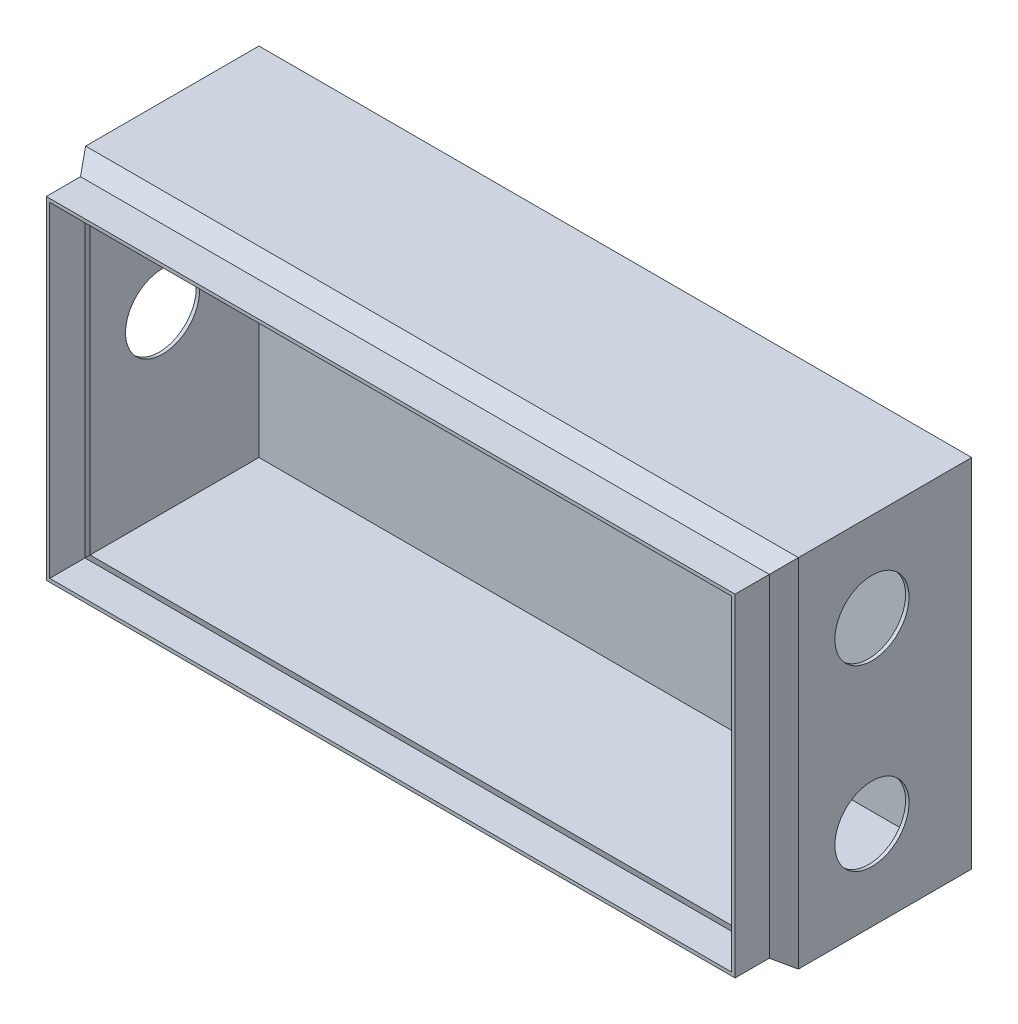
ISO-10303-21;
HEADER;
FILE_DESCRIPTION(('STEP AP214'),'2;1');
FILE_NAME('part.step','',(''),(''),'','','');
FILE_SCHEMA(('AUTOMOTIVE_DESIGN { 1 0 10303 214 1 1 1 1 }'));
ENDSEC;
DATA;
#1=APPLICATION_CONTEXT('core data for automotive mechanical design processes');
#2=APPLICATION_PROTOCOL_DEFINITION('international standard','automotive_design',2000,#1);
#3=PRODUCT_CONTEXT('',#1,'mechanical');
#4=PRODUCT('Part','Part','',(#3));
#5=PRODUCT_RELATED_PRODUCT_CATEGORY('part','',(#4));
#6=PRODUCT_DEFINITION_FORMATION('','',#4);
#7=PRODUCT_DEFINITION_CONTEXT('part definition',#1,'design');
#8=PRODUCT_DEFINITION('design','',#6,#7);
#9=PRODUCT_DEFINITION_SHAPE('','',#8);
#10=(LENGTH_UNIT() NAMED_UNIT(*) SI_UNIT(.MILLI.,.METRE.));
#11=(NAMED_UNIT(*) PLANE_ANGLE_UNIT() SI_UNIT($,.RADIAN.));
#12=(NAMED_UNIT(*) SI_UNIT($,.STERADIAN.) SOLID_ANGLE_UNIT());
#13=UNCERTAINTY_MEASURE_WITH_UNIT(LENGTH_MEASURE(1.E-05),#10,'distance_accuracy_value','');
#14=(GEOMETRIC_REPRESENTATION_CONTEXT(3) GLOBAL_UNCERTAINTY_ASSIGNED_CONTEXT((#13)) GLOBAL_UNIT_ASSIGNED_CONTEXT((#10,
#11,#12)) REPRESENTATION_CONTEXT('',''));
#15=CARTESIAN_POINT('',(0.,0.,0.));
#16=DIRECTION('',(0.,0.,1.));
#17=DIRECTION('',(1.,0.,0.));
#18=AXIS2_PLACEMENT_3D('',#15,#16,#17);
#19=CARTESIAN_POINT('',(-125.,-62.5,60.8));
#20=DIRECTION('',(0.,1.,0.));
#21=DIRECTION('',(-1.,0.,0.));
#22=AXIS2_PLACEMENT_3D('',#19,#20,#21);
#23=PLANE('',#22);
#24=DIRECTION('',(1.,0.,0.));
#25=VECTOR('',#24,1.);
#26=CARTESIAN_POINT('',(-125.,-62.5,0.));
#27=LINE('',#26,#25);
#28=CARTESIAN_POINT('',(-125.,-62.5,0.));
#29=VERTEX_POINT('',#28);
#30=CARTESIAN_POINT('',(125.,-62.5,0.));
#31=VERTEX_POINT('',#30);
#32=EDGE_CURVE('E260',#29,#31,#27,.T.);
#33=ORIENTED_EDGE('',*,*,#32,.T.);
#34=DIRECTION('',(0.,0.,-1.));
#35=VECTOR('',#34,1.);
#36=CARTESIAN_POINT('',(125.,-62.5,60.8));
#37=LINE('',#36,#35);
#38=CARTESIAN_POINT('',(125.,-62.5,60.8));
#39=VERTEX_POINT('',#38);
#40=EDGE_CURVE('E11',#39,#31,#37,.T.);
#41=ORIENTED_EDGE('',*,*,#40,.F.);
#42=DIRECTION('',(1.,0.,0.));
#43=VECTOR('',#42,1.);
#44=CARTESIAN_POINT('',(-125.,-62.5,60.8));
#45=LINE('',#44,#43);
#46=CARTESIAN_POINT('',(-125.,-62.5,60.8));
#47=VERTEX_POINT('',#46);
#48=EDGE_CURVE('E281',#47,#39,#45,.T.);
#49=ORIENTED_EDGE('',*,*,#48,.F.);
#50=DIRECTION('',(0.,0.,-1.));
#51=VECTOR('',#50,1.);
#52=CARTESIAN_POINT('',(-125.,-62.5,60.8));
#53=LINE('',#52,#51);
#54=EDGE_CURVE('E291',#47,#29,#53,.T.);
#55=ORIENTED_EDGE('',*,*,#54,.T.);
#56=EDGE_LOOP('',(#33,#41,#49,#55));
#57=FACE_BOUND('',#56,.T.);
#58=ADVANCED_FACE('F36',(#57),#23,.F.);
#59=CARTESIAN_POINT('',(125.,-62.5,60.8));
#60=DIRECTION('',(-1.,0.,0.));
#61=DIRECTION('',(0.,0.,1.));
#62=AXIS2_PLACEMENT_3D('',#59,#60,#61);
#63=PLANE('',#62);
#64=CARTESIAN_POINT('',(125.,-31.25,35.));
#65=DIRECTION('',(1.,0.,0.));
#66=DIRECTION('',(0.,0.,-1.));
#67=AXIS2_PLACEMENT_3D('',#64,#65,#66);
#68=CIRCLE('',#67,13.);
#69=CARTESIAN_POINT('',(125.,-31.25,22.));
#70=VERTEX_POINT('',#69);
#71=EDGE_CURVE('E317',#70,#70,#68,.T.);
#72=ORIENTED_EDGE('',*,*,#71,.F.);
#73=EDGE_LOOP('',(#72));
#74=FACE_BOUND('',#73,.T.);
#75=CARTESIAN_POINT('',(125.,31.25,35.));
#76=DIRECTION('',(1.,0.,0.));
#77=DIRECTION('',(0.,0.,-1.));
#78=AXIS2_PLACEMENT_3D('',#75,#76,#77);
#79=CIRCLE('',#78,13.);
#80=CARTESIAN_POINT('',(125.,31.25,22.));
#81=VERTEX_POINT('',#80);
#82=EDGE_CURVE('E307',#81,#81,#79,.T.);
#83=ORIENTED_EDGE('',*,*,#82,.F.);
#84=EDGE_LOOP('',(#83));
#85=FACE_BOUND('',#84,.T.);
#86=DIRECTION('',(0.,1.,0.));
#87=VECTOR('',#86,1.);
#88=CARTESIAN_POINT('',(125.,-62.5,0.));
#89=LINE('',#88,#87);
#90=CARTESIAN_POINT('',(125.,62.5,0.));
#91=VERTEX_POINT('',#90);
#92=EDGE_CURVE('E294',#31,#91,#89,.T.);
#93=ORIENTED_EDGE('',*,*,#92,.T.);
#94=DIRECTION('',(0.,0.,-1.));
#95=VECTOR('',#94,1.);
#96=CARTESIAN_POINT('',(125.,62.5,60.8));
#97=LINE('',#96,#95);
#98=CARTESIAN_POINT('',(125.,62.5,60.8));
#99=VERTEX_POINT('',#98);
#100=EDGE_CURVE('E44',#99,#91,#97,.T.);
#101=ORIENTED_EDGE('',*,*,#100,.F.);
#102=DIRECTION('',(0.,1.,0.));
#103=VECTOR('',#102,1.);
#104=CARTESIAN_POINT('',(125.,-62.5,60.8));
#105=LINE('',#104,#103);
#106=EDGE_CURVE('E86',#39,#99,#105,.T.);
#107=ORIENTED_EDGE('',*,*,#106,.F.);
#108=ORIENTED_EDGE('',*,*,#40,.T.);
#109=EDGE_LOOP('',(#93,#101,#107,#108));
#110=FACE_BOUND('',#109,.T.);
#111=ADVANCED_FACE('F376',(#74,#85,#110),#63,.F.);
#112=CARTESIAN_POINT('',(-125.,62.5,60.8));
#113=DIRECTION('',(0.,-1.,0.));
#114=DIRECTION('',(0.,0.,-1.));
#115=AXIS2_PLACEMENT_3D('',#112,#113,#114);
#116=PLANE('',#115);
#117=DIRECTION('',(-1.,0.,0.));
#118=VECTOR('',#117,1.);
#119=CARTESIAN_POINT('',(-125.,62.5,0.));
#120=LINE('',#119,#118);
#121=CARTESIAN_POINT('',(-125.,62.5,0.));
#122=VERTEX_POINT('',#121);
#123=EDGE_CURVE('E296',#91,#122,#120,.T.);
#124=ORIENTED_EDGE('',*,*,#123,.T.);
#125=DIRECTION('',(0.,0.,-1.));
#126=VECTOR('',#125,1.);
#127=CARTESIAN_POINT('',(-125.,62.5,60.8));
#128=LINE('',#127,#126);
#129=CARTESIAN_POINT('',(-125.,62.5,60.8));
#130=VERTEX_POINT('',#129);
#131=EDGE_CURVE('E61',#130,#122,#128,.T.);
#132=ORIENTED_EDGE('',*,*,#131,.F.);
#133=DIRECTION('',(-1.,0.,0.));
#134=VECTOR('',#133,1.);
#135=CARTESIAN_POINT('',(-125.,62.5,60.8));
#136=LINE('',#135,#134);
#137=EDGE_CURVE('E285',#99,#130,#136,.T.);
#138=ORIENTED_EDGE('',*,*,#137,.F.);
#139=ORIENTED_EDGE('',*,*,#100,.T.);
#140=EDGE_LOOP('',(#124,#132,#138,#139));
#141=FACE_BOUND('',#140,.T.);
#142=ADVANCED_FACE('F381',(#141),#116,.F.);
#143=CARTESIAN_POINT('',(-125.,-62.5,60.8));
#144=DIRECTION('',(1.,0.,0.));
#145=DIRECTION('',(0.,0.,-1.));
#146=AXIS2_PLACEMENT_3D('',#143,#144,#145);
#147=PLANE('',#146);
#148=CARTESIAN_POINT('',(-125.,0.,35.));
#149=DIRECTION('',(-1.,0.,0.));
#150=DIRECTION('',(0.,0.,1.));
#151=AXIS2_PLACEMENT_3D('',#148,#149,#150);
#152=CIRCLE('',#151,13.);
#153=CARTESIAN_POINT('',(-125.,0.,48.));
#154=VERTEX_POINT('',#153);
#155=EDGE_CURVE('E304',#154,#154,#152,.T.);
#156=ORIENTED_EDGE('',*,*,#155,.F.);
#157=EDGE_LOOP('',(#156));
#158=FACE_BOUND('',#157,.T.);
#159=DIRECTION('',(0.,-1.,0.));
#160=VECTOR('',#159,1.);
#161=CARTESIAN_POINT('',(-125.,-62.5,0.));
#162=LINE('',#161,#160);
#163=EDGE_CURVE('E81',#122,#29,#162,.T.);
#164=ORIENTED_EDGE('',*,*,#163,.T.);
#165=ORIENTED_EDGE('',*,*,#54,.F.);
#166=DIRECTION('',(0.,-1.,0.));
#167=VECTOR('',#166,1.);
#168=CARTESIAN_POINT('',(-125.,-62.5,60.8));
#169=LINE('',#168,#167);
#170=EDGE_CURVE('E288',#130,#47,#169,.T.);
#171=ORIENTED_EDGE('',*,*,#170,.F.);
#172=ORIENTED_EDGE('',*,*,#131,.T.);
#173=EDGE_LOOP('',(#164,#165,#171,#172));
#174=FACE_BOUND('',#173,.T.);
#175=ADVANCED_FACE('F438',(#158,#174),#147,.F.);
#176=CARTESIAN_POINT('',(0.,0.,0.));
#177=DIRECTION('',(0.,0.,1.));
#178=DIRECTION('',(1.,0.,0.));
#179=AXIS2_PLACEMENT_3D('',#176,#177,#178);
#180=PLANE('',#179);
#181=ORIENTED_EDGE('',*,*,#32,.F.);
#182=ORIENTED_EDGE('',*,*,#163,.F.);
#183=ORIENTED_EDGE('',*,*,#123,.F.);
#184=ORIENTED_EDGE('',*,*,#92,.F.);
#185=EDGE_LOOP('',(#181,#182,#183,#184));
#186=FACE_BOUND('',#185,.T.);
#187=ADVANCED_FACE('F385',(#186),#180,.F.);
#188=CARTESIAN_POINT('',(-125.,-62.5,60.8));
#189=DIRECTION('',(0.,-0.819152044288991,0.573576436351047));
#190=DIRECTION('',(0.,-0.573576436351047,-0.819152044288991));
#191=AXIS2_PLACEMENT_3D('',#188,#189,#190);
#192=PLANE('',#191);
#193=ORIENTED_EDGE('',*,*,#48,.T.);
#194=DIRECTION('',(0.497542812164524,-0.497542812164524,-0.710564775461629));
#195=VECTOR('',#194,1.);
#196=CARTESIAN_POINT('',(125.,-62.5,60.8));
#197=LINE('',#196,#195);
#198=CARTESIAN_POINT('',(120.798754770742,-58.2987547707417,66.8));
#199=VERTEX_POINT('',#198);
#200=EDGE_CURVE('E257',#199,#39,#197,.T.);
#201=ORIENTED_EDGE('',*,*,#200,.F.);
#202=DIRECTION('',(-1.,0.,0.));
#203=VECTOR('',#202,1.);
#204=CARTESIAN_POINT('',(-125.,-58.2987547707417,66.8));
#205=LINE('',#204,#203);
#206=CARTESIAN_POINT('',(-120.798754770742,-58.2987547707417,66.8));
#207=VERTEX_POINT('',#206);
#208=EDGE_CURVE('E256',#207,#199,#205,.F.);
#209=ORIENTED_EDGE('',*,*,#208,.F.);
#210=DIRECTION('',(-0.497542812164524,-0.497542812164524,-0.710564775461629));
#211=VECTOR('',#210,1.);
#212=CARTESIAN_POINT('',(-125.,-62.5,60.8));
#213=LINE('',#212,#211);
#214=EDGE_CURVE('E262',#207,#47,#213,.T.);
#215=ORIENTED_EDGE('',*,*,#214,.T.);
#216=EDGE_LOOP('',(#193,#201,#209,#215));
#217=FACE_BOUND('',#216,.T.);
#218=ADVANCED_FACE('F409',(#217),#192,.T.);
#219=CARTESIAN_POINT('',(125.,-62.5,60.8));
#220=DIRECTION('',(0.819152044288991,0.,0.573576436351047));
#221=DIRECTION('',(0.573576436351047,0.,-0.819152044288991));
#222=AXIS2_PLACEMENT_3D('',#219,#220,#221);
#223=PLANE('',#222);
#224=ORIENTED_EDGE('',*,*,#106,.T.);
#225=DIRECTION('',(0.497542812164524,0.497542812164524,-0.710564775461629));
#226=VECTOR('',#225,1.);
#227=CARTESIAN_POINT('',(125.,62.5,60.8));
#228=LINE('',#227,#226);
#229=CARTESIAN_POINT('',(120.798754770742,58.2987547707417,66.8));
#230=VERTEX_POINT('',#229);
#231=EDGE_CURVE('E261',#230,#99,#228,.T.);
#232=ORIENTED_EDGE('',*,*,#231,.F.);
#233=DIRECTION('',(0.,-1.,0.));
#234=VECTOR('',#233,1.);
#235=CARTESIAN_POINT('',(120.798754770742,-62.5,66.8));
#236=LINE('',#235,#234);
#237=EDGE_CURVE('E273',#199,#230,#236,.F.);
#238=ORIENTED_EDGE('',*,*,#237,.F.);
#239=ORIENTED_EDGE('',*,*,#200,.T.);
#240=EDGE_LOOP('',(#224,#232,#238,#239));
#241=FACE_BOUND('',#240,.T.);
#242=ADVANCED_FACE('F389',(#241),#223,.T.);
#243=CARTESIAN_POINT('',(125.,62.5,60.8));
#244=DIRECTION('',(0.,0.819152044288991,0.573576436351047));
#245=DIRECTION('',(0.,-0.573576436351047,0.819152044288991));
#246=AXIS2_PLACEMENT_3D('',#243,#244,#245);
#247=PLANE('',#246);
#248=ORIENTED_EDGE('',*,*,#137,.T.);
#249=DIRECTION('',(-0.497542812164524,0.497542812164524,-0.710564775461629));
#250=VECTOR('',#249,1.);
#251=CARTESIAN_POINT('',(-125.,62.5,60.8));
#252=LINE('',#251,#250);
#253=CARTESIAN_POINT('',(-120.798754770742,58.2987547707417,66.8));
#254=VERTEX_POINT('',#253);
#255=EDGE_CURVE('E265',#254,#130,#252,.T.);
#256=ORIENTED_EDGE('',*,*,#255,.F.);
#257=DIRECTION('',(1.,0.,0.));
#258=VECTOR('',#257,1.);
#259=CARTESIAN_POINT('',(125.,58.2987547707417,66.8));
#260=LINE('',#259,#258);
#261=EDGE_CURVE('E276',#230,#254,#260,.F.);
#262=ORIENTED_EDGE('',*,*,#261,.F.);
#263=ORIENTED_EDGE('',*,*,#231,.T.);
#264=EDGE_LOOP('',(#248,#256,#262,#263));
#265=FACE_BOUND('',#264,.T.);
#266=ADVANCED_FACE('F392',(#265),#247,.T.);
#267=CARTESIAN_POINT('',(-125.,62.5,60.8));
#268=DIRECTION('',(-0.819152044288991,0.,0.573576436351047));
#269=DIRECTION('',(0.573576436351047,0.,0.819152044288991));
#270=AXIS2_PLACEMENT_3D('',#267,#268,#269);
#271=PLANE('',#270);
#272=ORIENTED_EDGE('',*,*,#170,.T.);
#273=ORIENTED_EDGE('',*,*,#214,.F.);
#274=DIRECTION('',(0.,1.,0.));
#275=VECTOR('',#274,1.);
#276=CARTESIAN_POINT('',(-120.798754770742,62.5,66.8));
#277=LINE('',#276,#275);
#278=EDGE_CURVE('E266',#254,#207,#277,.F.);
#279=ORIENTED_EDGE('',*,*,#278,.F.);
#280=ORIENTED_EDGE('',*,*,#255,.T.);
#281=EDGE_LOOP('',(#272,#273,#279,#280));
#282=FACE_BOUND('',#281,.T.);
#283=ADVANCED_FACE('F411',(#282),#271,.T.);
#284=CARTESIAN_POINT('',(-120.798754770742,-58.2987547707417,78.8));
#285=DIRECTION('',(0.,1.,0.));
#286=DIRECTION('',(-1.,0.,0.));
#287=AXIS2_PLACEMENT_3D('',#284,#285,#286);
#288=PLANE('',#287);
#289=ORIENTED_EDGE('',*,*,#208,.T.);
#290=DIRECTION('',(0.,0.,-1.));
#291=VECTOR('',#290,1.);
#292=CARTESIAN_POINT('',(120.798754770742,-58.2987547707417,78.8));
#293=LINE('',#292,#291);
#294=CARTESIAN_POINT('',(120.798754770742,-58.2987547707417,78.8));
#295=VERTEX_POINT('',#294);
#296=EDGE_CURVE('E253',#295,#199,#293,.T.);
#297=ORIENTED_EDGE('',*,*,#296,.F.);
#298=DIRECTION('',(1.,0.,0.));
#299=VECTOR('',#298,1.);
#300=CARTESIAN_POINT('',(-120.798754770742,-58.2987547707417,78.8));
#301=LINE('',#300,#299);
#302=CARTESIAN_POINT('',(-120.798754770742,-58.2987547707417,78.8));
#303=VERTEX_POINT('',#302);
#304=EDGE_CURVE('E234',#303,#295,#301,.T.);
#305=ORIENTED_EDGE('',*,*,#304,.F.);
#306=DIRECTION('',(0.,0.,-1.));
#307=VECTOR('',#306,1.);
#308=CARTESIAN_POINT('',(-120.798754770742,-58.2987547707417,78.8));
#309=LINE('',#308,#307);
#310=EDGE_CURVE('E244',#303,#207,#309,.T.);
#311=ORIENTED_EDGE('',*,*,#310,.T.);
#312=EDGE_LOOP('',(#289,#297,#305,#311));
#313=FACE_BOUND('',#312,.T.);
#314=ADVANCED_FACE('F406',(#313),#288,.F.);
#315=CARTESIAN_POINT('',(120.798754770742,-58.2987547707417,78.8));
#316=DIRECTION('',(-1.,0.,0.));
#317=DIRECTION('',(0.,0.,1.));
#318=AXIS2_PLACEMENT_3D('',#315,#316,#317);
#319=PLANE('',#318);
#320=ORIENTED_EDGE('',*,*,#237,.T.);
#321=DIRECTION('',(0.,0.,-1.));
#322=VECTOR('',#321,1.);
#323=CARTESIAN_POINT('',(120.798754770742,58.2987547707417,78.8));
#324=LINE('',#323,#322);
#325=CARTESIAN_POINT('',(120.798754770742,58.2987547707417,78.8));
#326=VERTEX_POINT('',#325);
#327=EDGE_CURVE('E250',#326,#230,#324,.T.);
#328=ORIENTED_EDGE('',*,*,#327,.F.);
#329=DIRECTION('',(0.,1.,0.));
#330=VECTOR('',#329,1.);
#331=CARTESIAN_POINT('',(120.798754770742,-58.2987547707417,78.8));
#332=LINE('',#331,#330);
#333=EDGE_CURVE('E237',#295,#326,#332,.T.);
#334=ORIENTED_EDGE('',*,*,#333,.F.);
#335=ORIENTED_EDGE('',*,*,#296,.T.);
#336=EDGE_LOOP('',(#320,#328,#334,#335));
#337=FACE_BOUND('',#336,.T.);
#338=ADVANCED_FACE('F398',(#337),#319,.F.);
#339=CARTESIAN_POINT('',(120.798754770742,58.2987547707417,78.8));
#340=DIRECTION('',(0.,-1.,0.));
#341=DIRECTION('',(0.,0.,-1.));
#342=AXIS2_PLACEMENT_3D('',#339,#340,#341);
#343=PLANE('',#342);
#344=ORIENTED_EDGE('',*,*,#261,.T.);
#345=DIRECTION('',(0.,0.,-1.));
#346=VECTOR('',#345,1.);
#347=CARTESIAN_POINT('',(-120.798754770742,58.2987547707417,78.8));
#348=LINE('',#347,#346);
#349=CARTESIAN_POINT('',(-120.798754770742,58.2987547707417,78.8));
#350=VERTEX_POINT('',#349);
#351=EDGE_CURVE('E247',#350,#254,#348,.T.);
#352=ORIENTED_EDGE('',*,*,#351,.F.);
#353=DIRECTION('',(-1.,0.,0.));
#354=VECTOR('',#353,1.);
#355=CARTESIAN_POINT('',(120.798754770742,58.2987547707417,78.8));
#356=LINE('',#355,#354);
#357=EDGE_CURVE('E240',#326,#350,#356,.T.);
#358=ORIENTED_EDGE('',*,*,#357,.F.);
#359=ORIENTED_EDGE('',*,*,#327,.T.);
#360=EDGE_LOOP('',(#344,#352,#358,#359));
#361=FACE_BOUND('',#360,.T.);
#362=ADVANCED_FACE('F401',(#361),#343,.F.);
#363=CARTESIAN_POINT('',(-120.798754770742,58.2987547707417,78.8));
#364=DIRECTION('',(1.,0.,0.));
#365=DIRECTION('',(0.,0.,-1.));
#366=AXIS2_PLACEMENT_3D('',#363,#364,#365);
#367=PLANE('',#366);
#368=ORIENTED_EDGE('',*,*,#278,.T.);
#369=ORIENTED_EDGE('',*,*,#310,.F.);
#370=DIRECTION('',(0.,-1.,0.));
#371=VECTOR('',#370,1.);
#372=CARTESIAN_POINT('',(-120.798754770742,58.2987547707417,78.8));
#373=LINE('',#372,#371);
#374=EDGE_CURVE('E242',#350,#303,#373,.T.);
#375=ORIENTED_EDGE('',*,*,#374,.F.);
#376=ORIENTED_EDGE('',*,*,#351,.T.);
#377=EDGE_LOOP('',(#368,#369,#375,#376));
#378=FACE_BOUND('',#377,.T.);
#379=ADVANCED_FACE('F413',(#378),#367,.F.);
#380=CARTESIAN_POINT('',(0.,0.,78.8));
#381=DIRECTION('',(0.,0.,1.));
#382=DIRECTION('',(1.,0.,0.));
#383=AXIS2_PLACEMENT_3D('',#380,#381,#382);
#384=PLANE('',#383);
#385=DIRECTION('',(1.,0.,0.));
#386=VECTOR('',#385,1.);
#387=CARTESIAN_POINT('',(-120.798754770742,-57.0987547707417,78.8));
#388=LINE('',#387,#386);
#389=CARTESIAN_POINT('',(-119.598754770742,-57.0987547707417,78.8));
#390=VERTEX_POINT('',#389);
#391=CARTESIAN_POINT('',(119.598754770742,-57.0987547707417,78.8));
#392=VERTEX_POINT('',#391);
#393=EDGE_CURVE('E226',#390,#392,#388,.T.);
#394=ORIENTED_EDGE('',*,*,#393,.F.);
#395=DIRECTION('',(0.,-1.,0.));
#396=VECTOR('',#395,1.);
#397=CARTESIAN_POINT('',(-119.598754770742,58.2987547707417,78.8));
#398=LINE('',#397,#396);
#399=CARTESIAN_POINT('',(-119.598754770742,57.0987547707417,78.8));
#400=VERTEX_POINT('',#399);
#401=EDGE_CURVE('E222',#400,#390,#398,.T.);
#402=ORIENTED_EDGE('',*,*,#401,.F.);
#403=DIRECTION('',(-1.,0.,0.));
#404=VECTOR('',#403,1.);
#405=CARTESIAN_POINT('',(120.798754770742,57.0987547707417,78.8));
#406=LINE('',#405,#404);
#407=CARTESIAN_POINT('',(119.598754770742,57.0987547707417,78.8));
#408=VERTEX_POINT('',#407);
#409=EDGE_CURVE('E231',#408,#400,#406,.T.);
#410=ORIENTED_EDGE('',*,*,#409,.F.);
#411=DIRECTION('',(0.,1.,0.));
#412=VECTOR('',#411,1.);
#413=CARTESIAN_POINT('',(119.598754770742,-58.2987547707417,78.8));
#414=LINE('',#413,#412);
#415=EDGE_CURVE('E228',#392,#408,#414,.T.);
#416=ORIENTED_EDGE('',*,*,#415,.F.);
#417=EDGE_LOOP('',(#394,#402,#410,#416));
#418=FACE_BOUND('',#417,.T.);
#419=ORIENTED_EDGE('',*,*,#304,.T.);
#420=ORIENTED_EDGE('',*,*,#333,.T.);
#421=ORIENTED_EDGE('',*,*,#357,.T.);
#422=ORIENTED_EDGE('',*,*,#374,.T.);
#423=EDGE_LOOP('',(#419,#420,#421,#422));
#424=FACE_BOUND('',#423,.T.);
#425=ADVANCED_FACE('F351',(#418,#424),#384,.T.);
#426=CARTESIAN_POINT('',(-125.,-61.3,60.8));
#427=DIRECTION('',(0.,1.,0.));
#428=DIRECTION('',(-1.,0.,0.));
#429=AXIS2_PLACEMENT_3D('',#426,#427,#428);
#430=PLANE('',#429);
#431=DIRECTION('',(1.,0.,0.));
#432=VECTOR('',#431,1.);
#433=CARTESIAN_POINT('',(-125.,-61.3,1.2));
#434=LINE('',#433,#432);
#435=CARTESIAN_POINT('',(-123.8,-61.3,1.2));
#436=VERTEX_POINT('',#435);
#437=CARTESIAN_POINT('',(123.8,-61.3,1.2));
#438=VERTEX_POINT('',#437);
#439=EDGE_CURVE('E182',#436,#438,#434,.T.);
#440=ORIENTED_EDGE('',*,*,#439,.F.);
#441=DIRECTION('',(0.,0.,-1.));
#442=VECTOR('',#441,1.);
#443=CARTESIAN_POINT('',(-123.8,-61.3,60.8));
#444=LINE('',#443,#442);
#445=CARTESIAN_POINT('',(-123.8,-61.3,60.4216414533452));
#446=VERTEX_POINT('',#445);
#447=EDGE_CURVE('E178',#446,#436,#444,.T.);
#448=ORIENTED_EDGE('',*,*,#447,.F.);
#449=DIRECTION('',(-1.,0.,0.));
#450=VECTOR('',#449,1.);
#451=CARTESIAN_POINT('',(-125.,-61.3,60.4216414533452));
#452=LINE('',#451,#450);
#453=CARTESIAN_POINT('',(123.8,-61.3,60.4216414533452));
#454=VERTEX_POINT('',#453);
#455=EDGE_CURVE('E162',#446,#454,#452,.F.);
#456=ORIENTED_EDGE('',*,*,#455,.T.);
#457=DIRECTION('',(0.,0.,-1.));
#458=VECTOR('',#457,1.);
#459=CARTESIAN_POINT('',(123.8,-61.3,60.8));
#460=LINE('',#459,#458);
#461=EDGE_CURVE('E238',#454,#438,#460,.T.);
#462=ORIENTED_EDGE('',*,*,#461,.T.);
#463=EDGE_LOOP('',(#440,#448,#456,#462));
#464=FACE_BOUND('',#463,.T.);
#465=ADVANCED_FACE('F180',(#464),#430,.T.);
#466=CARTESIAN_POINT('',(123.8,-62.5,60.8));
#467=DIRECTION('',(-1.,0.,0.));
#468=DIRECTION('',(0.,0.,1.));
#469=AXIS2_PLACEMENT_3D('',#466,#467,#468);
#470=PLANE('',#469);
#471=CARTESIAN_POINT('',(123.8,-31.25,35.));
#472=DIRECTION('',(-1.,0.,0.));
#473=DIRECTION('',(0.,0.,1.));
#474=AXIS2_PLACEMENT_3D('',#471,#472,#473);
#475=CIRCLE('',#474,13.);
#476=CARTESIAN_POINT('',(123.8,-31.25,48.));
#477=VERTEX_POINT('',#476);
#478=EDGE_CURVE('E39',#477,#477,#475,.T.);
#479=ORIENTED_EDGE('',*,*,#478,.F.);
#480=EDGE_LOOP('',(#479));
#481=FACE_BOUND('',#480,.T.);
#482=CARTESIAN_POINT('',(123.8,31.25,35.));
#483=DIRECTION('',(-1.,0.,0.));
#484=DIRECTION('',(0.,0.,1.));
#485=AXIS2_PLACEMENT_3D('',#482,#483,#484);
#486=CIRCLE('',#485,13.);
#487=CARTESIAN_POINT('',(123.8,31.25,48.));
#488=VERTEX_POINT('',#487);
#489=EDGE_CURVE('E305',#488,#488,#486,.T.);
#490=ORIENTED_EDGE('',*,*,#489,.F.);
#491=EDGE_LOOP('',(#490));
#492=FACE_BOUND('',#491,.T.);
#493=DIRECTION('',(0.,1.,0.));
#494=VECTOR('',#493,1.);
#495=CARTESIAN_POINT('',(123.8,-62.5,1.2));
#496=LINE('',#495,#494);
#497=CARTESIAN_POINT('',(123.8,61.3,1.2));
#498=VERTEX_POINT('',#497);
#499=EDGE_CURVE('E321',#438,#498,#496,.T.);
#500=ORIENTED_EDGE('',*,*,#499,.F.);
#501=ORIENTED_EDGE('',*,*,#461,.F.);
#502=DIRECTION('',(0.,-1.,0.));
#503=VECTOR('',#502,1.);
#504=CARTESIAN_POINT('',(123.8,-62.5,60.4216414533452));
#505=LINE('',#504,#503);
#506=CARTESIAN_POINT('',(123.8,61.3,60.4216414533452));
#507=VERTEX_POINT('',#506);
#508=EDGE_CURVE('E173',#454,#507,#505,.F.);
#509=ORIENTED_EDGE('',*,*,#508,.T.);
#510=DIRECTION('',(0.,0.,-1.));
#511=VECTOR('',#510,1.);
#512=CARTESIAN_POINT('',(123.8,61.3,60.8));
#513=LINE('',#512,#511);
#514=EDGE_CURVE('E322',#507,#498,#513,.T.);
#515=ORIENTED_EDGE('',*,*,#514,.T.);
#516=EDGE_LOOP('',(#500,#501,#509,#515));
#517=FACE_BOUND('',#516,.T.);
#518=ADVANCED_FACE('F363',(#481,#492,#517),#470,.T.);
#519=CARTESIAN_POINT('',(-125.,61.3,60.8));
#520=DIRECTION('',(0.,-1.,0.));
#521=DIRECTION('',(0.,0.,-1.));
#522=AXIS2_PLACEMENT_3D('',#519,#520,#521);
#523=PLANE('',#522);
#524=DIRECTION('',(-1.,0.,0.));
#525=VECTOR('',#524,1.);
#526=CARTESIAN_POINT('',(-125.,61.3,1.2));
#527=LINE('',#526,#525);
#528=CARTESIAN_POINT('',(-123.8,61.3,1.2));
#529=VERTEX_POINT('',#528);
#530=EDGE_CURVE('E325',#498,#529,#527,.T.);
#531=ORIENTED_EDGE('',*,*,#530,.F.);
#532=ORIENTED_EDGE('',*,*,#514,.F.);
#533=DIRECTION('',(1.,0.,0.));
#534=VECTOR('',#533,1.);
#535=CARTESIAN_POINT('',(125.,61.3,60.4216414533452));
#536=LINE('',#535,#534);
#537=CARTESIAN_POINT('',(-123.8,61.3,60.4216414533452));
#538=VERTEX_POINT('',#537);
#539=EDGE_CURVE('E193',#507,#538,#536,.F.);
#540=ORIENTED_EDGE('',*,*,#539,.T.);
#541=DIRECTION('',(0.,0.,-1.));
#542=VECTOR('',#541,1.);
#543=CARTESIAN_POINT('',(-123.8,61.3,60.8));
#544=LINE('',#543,#542);
#545=EDGE_CURVE('E185',#538,#529,#544,.T.);
#546=ORIENTED_EDGE('',*,*,#545,.T.);
#547=EDGE_LOOP('',(#531,#532,#540,#546));
#548=FACE_BOUND('',#547,.T.);
#549=ADVANCED_FACE('F337',(#548),#523,.T.);
#550=CARTESIAN_POINT('',(-123.8,-62.5,60.8));
#551=DIRECTION('',(1.,0.,0.));
#552=DIRECTION('',(0.,0.,-1.));
#553=AXIS2_PLACEMENT_3D('',#550,#551,#552);
#554=PLANE('',#553);
#555=CARTESIAN_POINT('',(-123.8,0.,35.));
#556=DIRECTION('',(1.,0.,0.));
#557=DIRECTION('',(0.,0.,-1.));
#558=AXIS2_PLACEMENT_3D('',#555,#556,#557);
#559=CIRCLE('',#558,13.);
#560=CARTESIAN_POINT('',(-123.8,0.,22.));
#561=VERTEX_POINT('',#560);
#562=EDGE_CURVE('E229',#561,#561,#559,.T.);
#563=ORIENTED_EDGE('',*,*,#562,.F.);
#564=EDGE_LOOP('',(#563));
#565=FACE_BOUND('',#564,.T.);
#566=DIRECTION('',(0.,-1.,0.));
#567=VECTOR('',#566,1.);
#568=CARTESIAN_POINT('',(-123.8,-62.5,1.2));
#569=LINE('',#568,#567);
#570=EDGE_CURVE('E174',#529,#436,#569,.T.);
#571=ORIENTED_EDGE('',*,*,#570,.F.);
#572=ORIENTED_EDGE('',*,*,#545,.F.);
#573=DIRECTION('',(0.,1.,0.));
#574=VECTOR('',#573,1.);
#575=CARTESIAN_POINT('',(-123.8,62.5,60.4216414533452));
#576=LINE('',#575,#574);
#577=EDGE_CURVE('E186',#538,#446,#576,.F.);
#578=ORIENTED_EDGE('',*,*,#577,.T.);
#579=ORIENTED_EDGE('',*,*,#447,.T.);
#580=EDGE_LOOP('',(#571,#572,#578,#579));
#581=FACE_BOUND('',#580,.T.);
#582=ADVANCED_FACE('F189',(#565,#581),#554,.T.);
#583=CARTESIAN_POINT('',(0.,0.,1.2));
#584=DIRECTION('',(0.,0.,1.));
#585=DIRECTION('',(1.,0.,0.));
#586=AXIS2_PLACEMENT_3D('',#583,#584,#585);
#587=PLANE('',#586);
#588=ORIENTED_EDGE('',*,*,#439,.T.);
#589=ORIENTED_EDGE('',*,*,#499,.T.);
#590=ORIENTED_EDGE('',*,*,#530,.T.);
#591=ORIENTED_EDGE('',*,*,#570,.T.);
#592=EDGE_LOOP('',(#588,#589,#590,#591));
#593=FACE_BOUND('',#592,.T.);
#594=ADVANCED_FACE('F334',(#593),#587,.T.);
#595=CARTESIAN_POINT('',(-125.,-61.5170175468532,60.1117082763787));
#596=DIRECTION('',(0.,-0.819152044288991,0.573576436351047));
#597=DIRECTION('',(0.,-0.573576436351047,-0.819152044288991));
#598=AXIS2_PLACEMENT_3D('',#595,#596,#597);
#599=PLANE('',#598);
#600=ORIENTED_EDGE('',*,*,#455,.F.);
#601=DIRECTION('',(-0.497542812164524,-0.497542812164524,-0.710564775461629));
#602=VECTOR('',#601,1.);
#603=CARTESIAN_POINT('',(-124.260353722638,-61.7603537226375,59.7641882019641));
#604=LINE('',#603,#602);
#605=CARTESIAN_POINT('',(-119.598754770742,-57.0987547707417,66.4216414533452));
#606=VERTEX_POINT('',#605);
#607=EDGE_CURVE('E167',#606,#446,#604,.T.);
#608=ORIENTED_EDGE('',*,*,#607,.F.);
#609=DIRECTION('',(-1.,0.,0.));
#610=VECTOR('',#609,1.);
#611=CARTESIAN_POINT('',(-125.,-57.0987547707417,66.4216414533452));
#612=LINE('',#611,#610);
#613=CARTESIAN_POINT('',(119.598754770742,-57.0987547707417,66.4216414533452));
#614=VERTEX_POINT('',#613);
#615=EDGE_CURVE('E207',#606,#614,#612,.F.);
#616=ORIENTED_EDGE('',*,*,#615,.T.);
#617=DIRECTION('',(0.497542812164524,-0.497542812164524,-0.710564775461629));
#618=VECTOR('',#617,1.);
#619=CARTESIAN_POINT('',(124.260353722638,-61.7603537226375,59.7641882019641));
#620=LINE('',#619,#618);
#621=EDGE_CURVE('E170',#614,#454,#620,.T.);
#622=ORIENTED_EDGE('',*,*,#621,.T.);
#623=EDGE_LOOP('',(#600,#608,#616,#622));
#624=FACE_BOUND('',#623,.T.);
#625=ADVANCED_FACE('F164',(#624),#599,.F.);
#626=CARTESIAN_POINT('',(124.017017546853,-62.5,60.1117082763787));
#627=DIRECTION('',(0.819152044288991,0.,0.573576436351047));
#628=DIRECTION('',(0.573576436351047,0.,-0.819152044288991));
#629=AXIS2_PLACEMENT_3D('',#626,#627,#628);
#630=PLANE('',#629);
#631=ORIENTED_EDGE('',*,*,#508,.F.);
#632=ORIENTED_EDGE('',*,*,#621,.F.);
#633=DIRECTION('',(0.,-1.,0.));
#634=VECTOR('',#633,1.);
#635=CARTESIAN_POINT('',(119.598754770742,-62.5,66.4216414533452));
#636=LINE('',#635,#634);
#637=CARTESIAN_POINT('',(119.598754770742,57.0987547707417,66.4216414533452));
#638=VERTEX_POINT('',#637);
#639=EDGE_CURVE('E211',#614,#638,#636,.F.);
#640=ORIENTED_EDGE('',*,*,#639,.T.);
#641=DIRECTION('',(0.497542812164524,0.497542812164524,-0.710564775461629));
#642=VECTOR('',#641,1.);
#643=CARTESIAN_POINT('',(124.260353722638,61.7603537226375,59.7641882019641));
#644=LINE('',#643,#642);
#645=EDGE_CURVE('E201',#638,#507,#644,.T.);
#646=ORIENTED_EDGE('',*,*,#645,.T.);
#647=EDGE_LOOP('',(#631,#632,#640,#646));
#648=FACE_BOUND('',#647,.T.);
#649=ADVANCED_FACE('F360',(#648),#630,.F.);
#650=CARTESIAN_POINT('',(125.,61.5170175468532,60.1117082763787));
#651=DIRECTION('',(0.,0.819152044288991,0.573576436351047));
#652=DIRECTION('',(0.,-0.573576436351047,0.819152044288991));
#653=AXIS2_PLACEMENT_3D('',#650,#651,#652);
#654=PLANE('',#653);
#655=ORIENTED_EDGE('',*,*,#539,.F.);
#656=ORIENTED_EDGE('',*,*,#645,.F.);
#657=DIRECTION('',(1.,0.,0.));
#658=VECTOR('',#657,1.);
#659=CARTESIAN_POINT('',(125.,57.0987547707417,66.4216414533452));
#660=LINE('',#659,#658);
#661=CARTESIAN_POINT('',(-119.598754770742,57.0987547707417,66.4216414533452));
#662=VERTEX_POINT('',#661);
#663=EDGE_CURVE('E203',#638,#662,#660,.F.);
#664=ORIENTED_EDGE('',*,*,#663,.T.);
#665=DIRECTION('',(-0.497542812164524,0.497542812164524,-0.710564775461629));
#666=VECTOR('',#665,1.);
#667=CARTESIAN_POINT('',(-124.260353722638,61.7603537226375,59.7641882019641));
#668=LINE('',#667,#666);
#669=EDGE_CURVE('E198',#662,#538,#668,.T.);
#670=ORIENTED_EDGE('',*,*,#669,.T.);
#671=EDGE_LOOP('',(#655,#656,#664,#670));
#672=FACE_BOUND('',#671,.T.);
#673=ADVANCED_FACE('F340',(#672),#654,.F.);
#674=CARTESIAN_POINT('',(-124.017017546853,62.5,60.1117082763787));
#675=DIRECTION('',(-0.819152044288991,0.,0.573576436351047));
#676=DIRECTION('',(0.573576436351047,0.,0.819152044288991));
#677=AXIS2_PLACEMENT_3D('',#674,#675,#676);
#678=PLANE('',#677);
#679=ORIENTED_EDGE('',*,*,#577,.F.);
#680=ORIENTED_EDGE('',*,*,#669,.F.);
#681=DIRECTION('',(0.,1.,0.));
#682=VECTOR('',#681,1.);
#683=CARTESIAN_POINT('',(-119.598754770742,62.5,66.4216414533452));
#684=LINE('',#683,#682);
#685=EDGE_CURVE('E196',#662,#606,#684,.F.);
#686=ORIENTED_EDGE('',*,*,#685,.T.);
#687=ORIENTED_EDGE('',*,*,#607,.T.);
#688=EDGE_LOOP('',(#679,#680,#686,#687));
#689=FACE_BOUND('',#688,.T.);
#690=ADVANCED_FACE('F195',(#689),#678,.F.);
#691=CARTESIAN_POINT('',(-120.798754770742,-57.0987547707417,78.8));
#692=DIRECTION('',(0.,1.,0.));
#693=DIRECTION('',(-1.,0.,0.));
#694=AXIS2_PLACEMENT_3D('',#691,#692,#693);
#695=PLANE('',#694);
#696=ORIENTED_EDGE('',*,*,#615,.F.);
#697=DIRECTION('',(0.,0.,-1.));
#698=VECTOR('',#697,1.);
#699=CARTESIAN_POINT('',(-119.598754770742,-57.0987547707417,78.8));
#700=LINE('',#699,#698);
#701=EDGE_CURVE('E220',#390,#606,#700,.T.);
#702=ORIENTED_EDGE('',*,*,#701,.F.);
#703=ORIENTED_EDGE('',*,*,#393,.T.);
#704=DIRECTION('',(0.,0.,-1.));
#705=VECTOR('',#704,1.);
#706=CARTESIAN_POINT('',(119.598754770742,-57.0987547707417,78.8));
#707=LINE('',#706,#705);
#708=EDGE_CURVE('E216',#392,#614,#707,.T.);
#709=ORIENTED_EDGE('',*,*,#708,.T.);
#710=EDGE_LOOP('',(#696,#702,#703,#709));
#711=FACE_BOUND('',#710,.T.);
#712=ADVANCED_FACE('F347',(#711),#695,.T.);
#713=CARTESIAN_POINT('',(119.598754770742,-58.2987547707417,78.8));
#714=DIRECTION('',(-1.,0.,0.));
#715=DIRECTION('',(0.,0.,1.));
#716=AXIS2_PLACEMENT_3D('',#713,#714,#715);
#717=PLANE('',#716);
#718=ORIENTED_EDGE('',*,*,#639,.F.);
#719=ORIENTED_EDGE('',*,*,#708,.F.);
#720=ORIENTED_EDGE('',*,*,#415,.T.);
#721=DIRECTION('',(0.,0.,-1.));
#722=VECTOR('',#721,1.);
#723=CARTESIAN_POINT('',(119.598754770742,57.0987547707417,78.8));
#724=LINE('',#723,#722);
#725=EDGE_CURVE('E219',#408,#638,#724,.T.);
#726=ORIENTED_EDGE('',*,*,#725,.T.);
#727=EDGE_LOOP('',(#718,#719,#720,#726));
#728=FACE_BOUND('',#727,.T.);
#729=ADVANCED_FACE('F356',(#728),#717,.T.);
#730=CARTESIAN_POINT('',(120.798754770742,57.0987547707417,78.8));
#731=DIRECTION('',(0.,-1.,0.));
#732=DIRECTION('',(0.,0.,-1.));
#733=AXIS2_PLACEMENT_3D('',#730,#731,#732);
#734=PLANE('',#733);
#735=ORIENTED_EDGE('',*,*,#663,.F.);
#736=ORIENTED_EDGE('',*,*,#725,.F.);
#737=ORIENTED_EDGE('',*,*,#409,.T.);
#738=DIRECTION('',(0.,0.,-1.));
#739=VECTOR('',#738,1.);
#740=CARTESIAN_POINT('',(-119.598754770742,57.0987547707417,78.8));
#741=LINE('',#740,#739);
#742=EDGE_CURVE('E52',#400,#662,#741,.T.);
#743=ORIENTED_EDGE('',*,*,#742,.T.);
#744=EDGE_LOOP('',(#735,#736,#737,#743));
#745=FACE_BOUND('',#744,.T.);
#746=ADVANCED_FACE('F358',(#745),#734,.T.);
#747=CARTESIAN_POINT('',(-119.598754770742,58.2987547707417,78.8));
#748=DIRECTION('',(1.,0.,0.));
#749=DIRECTION('',(0.,0.,-1.));
#750=AXIS2_PLACEMENT_3D('',#747,#748,#749);
#751=PLANE('',#750);
#752=ORIENTED_EDGE('',*,*,#685,.F.);
#753=ORIENTED_EDGE('',*,*,#742,.F.);
#754=ORIENTED_EDGE('',*,*,#401,.T.);
#755=ORIENTED_EDGE('',*,*,#701,.T.);
#756=EDGE_LOOP('',(#752,#753,#754,#755));
#757=FACE_BOUND('',#756,.T.);
#758=ADVANCED_FACE('F342',(#757),#751,.T.);
#759=CARTESIAN_POINT('',(-113.,0.,35.));
#760=DIRECTION('',(-1.,0.,0.));
#761=DIRECTION('',(0.,0.,1.));
#762=AXIS2_PLACEMENT_3D('',#759,#760,#761);
#763=CYLINDRICAL_SURFACE('',#762,13.);
#764=ORIENTED_EDGE('',*,*,#562,.T.);
#765=EDGE_LOOP('',(#764));
#766=FACE_BOUND('',#765,.T.);
#767=ORIENTED_EDGE('',*,*,#155,.T.);
#768=EDGE_LOOP('',(#767));
#769=FACE_BOUND('',#768,.T.);
#770=ADVANCED_FACE('F581',(#766,#769),#763,.F.);
#771=CARTESIAN_POINT('',(113.,31.25,35.));
#772=DIRECTION('',(1.,0.,0.));
#773=DIRECTION('',(0.,0.,-1.));
#774=AXIS2_PLACEMENT_3D('',#771,#772,#773);
#775=CYLINDRICAL_SURFACE('',#774,13.);
#776=ORIENTED_EDGE('',*,*,#489,.T.);
#777=EDGE_LOOP('',(#776));
#778=FACE_BOUND('',#777,.T.);
#779=ORIENTED_EDGE('',*,*,#82,.T.);
#780=EDGE_LOOP('',(#779));
#781=FACE_BOUND('',#780,.T.);
#782=ADVANCED_FACE('F590',(#778,#781),#775,.F.);
#783=CARTESIAN_POINT('',(113.,-31.25,35.));
#784=DIRECTION('',(1.,0.,0.));
#785=DIRECTION('',(0.,0.,-1.));
#786=AXIS2_PLACEMENT_3D('',#783,#784,#785);
#787=CYLINDRICAL_SURFACE('',#786,13.);
#788=ORIENTED_EDGE('',*,*,#478,.T.);
#789=EDGE_LOOP('',(#788));
#790=FACE_BOUND('',#789,.T.);
#791=ORIENTED_EDGE('',*,*,#71,.T.);
#792=EDGE_LOOP('',(#791));
#793=FACE_BOUND('',#792,.T.);
#794=ADVANCED_FACE('F597',(#790,#793),#787,.F.);
#795=CLOSED_SHELL('',(#58,#111,#142,#175,#187,#218,#242,#266,#283,#314,#338,#362,#379,#425,#465,
#518,#549,#582,#594,#625,#649,#673,#690,#712,#729,#746,#758,#770,#782,#794));
#796=MANIFOLD_SOLID_BREP('B2',#795);
#797=ADVANCED_BREP_SHAPE_REPRESENTATION('',(#18,#796),#14);
#798=SHAPE_DEFINITION_REPRESENTATION(#9,#797);
ENDSEC;
END-ISO-10303-21;
